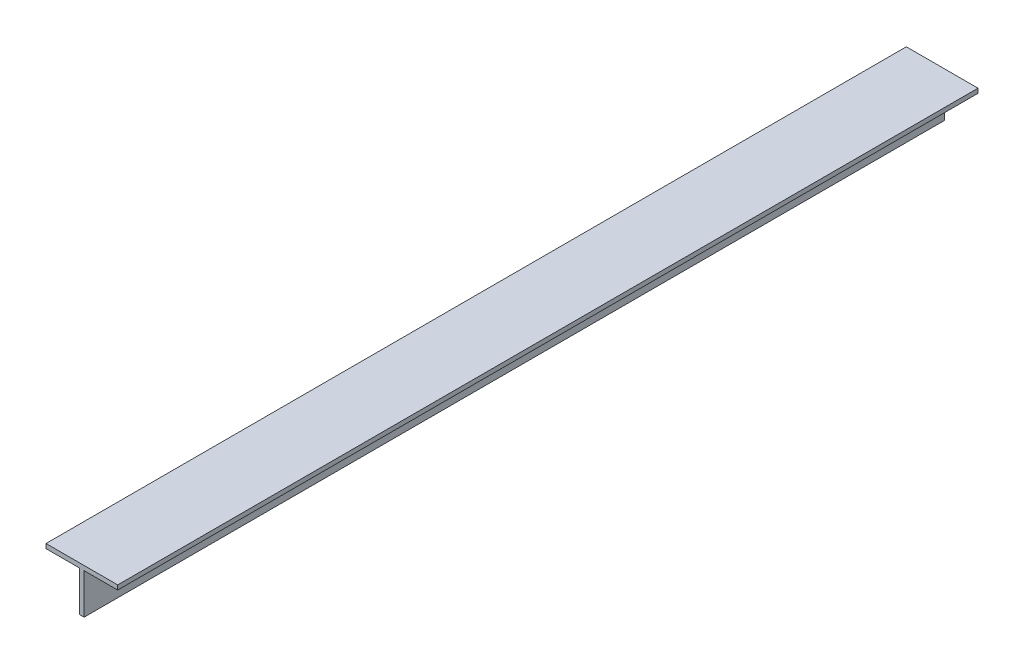
ISO-10303-21;
HEADER;
FILE_DESCRIPTION(('STEP AP214'),'2;1');
FILE_NAME('part.step','',(''),(''),'','','');
FILE_SCHEMA(('AUTOMOTIVE_DESIGN { 1 0 10303 214 1 1 1 1 }'));
ENDSEC;
DATA;
#1=APPLICATION_CONTEXT('core data for automotive mechanical design processes');
#2=APPLICATION_PROTOCOL_DEFINITION('international standard','automotive_design',2000,#1);
#3=PRODUCT_CONTEXT('',#1,'mechanical');
#4=PRODUCT('Part','Part','',(#3));
#5=PRODUCT_RELATED_PRODUCT_CATEGORY('part','',(#4));
#6=PRODUCT_DEFINITION_FORMATION('','',#4);
#7=PRODUCT_DEFINITION_CONTEXT('part definition',#1,'design');
#8=PRODUCT_DEFINITION('design','',#6,#7);
#9=PRODUCT_DEFINITION_SHAPE('','',#8);
#10=(LENGTH_UNIT() NAMED_UNIT(*) SI_UNIT(.MILLI.,.METRE.));
#11=(NAMED_UNIT(*) PLANE_ANGLE_UNIT() SI_UNIT($,.RADIAN.));
#12=(NAMED_UNIT(*) SI_UNIT($,.STERADIAN.) SOLID_ANGLE_UNIT());
#13=UNCERTAINTY_MEASURE_WITH_UNIT(LENGTH_MEASURE(1.E-05),#10,'distance_accuracy_value','');
#14=(GEOMETRIC_REPRESENTATION_CONTEXT(3) GLOBAL_UNCERTAINTY_ASSIGNED_CONTEXT((#13)) GLOBAL_UNIT_ASSIGNED_CONTEXT((#10,
#11,#12)) REPRESENTATION_CONTEXT('',''));
#15=CARTESIAN_POINT('',(0.,0.,0.));
#16=DIRECTION('',(0.,0.,1.));
#17=DIRECTION('',(1.,0.,0.));
#18=AXIS2_PLACEMENT_3D('',#15,#16,#17);
#19=CARTESIAN_POINT('',(25.4,31.75,304.8));
#20=DIRECTION('',(0.,-1.,0.));
#21=DIRECTION('',(0.,0.,-1.));
#22=AXIS2_PLACEMENT_3D('',#19,#20,#21);
#23=PLANE('',#22);
#24=DIRECTION('',(-1.,0.,0.));
#25=VECTOR('',#24,1.);
#26=CARTESIAN_POINT('',(25.4,31.75,-304.8));
#27=LINE('',#26,#25);
#28=CARTESIAN_POINT('',(25.4,31.75,-304.8));
#29=VERTEX_POINT('',#28);
#30=CARTESIAN_POINT('',(-25.4,31.75,-304.8));
#31=VERTEX_POINT('',#30);
#32=EDGE_CURVE('E144',#29,#31,#27,.T.);
#33=ORIENTED_EDGE('',*,*,#32,.T.);
#34=DIRECTION('',(0.,0.,-1.));
#35=VECTOR('',#34,1.);
#36=CARTESIAN_POINT('',(-25.4,31.75,304.8));
#37=LINE('',#36,#35);
#38=CARTESIAN_POINT('',(-25.4,31.75,304.8));
#39=VERTEX_POINT('',#38);
#40=EDGE_CURVE('E11',#39,#31,#37,.T.);
#41=ORIENTED_EDGE('',*,*,#40,.F.);
#42=DIRECTION('',(-1.,0.,0.));
#43=VECTOR('',#42,1.);
#44=CARTESIAN_POINT('',(25.4,31.75,304.8));
#45=LINE('',#44,#43);
#46=CARTESIAN_POINT('',(25.4,31.75,304.8));
#47=VERTEX_POINT('',#46);
#48=EDGE_CURVE('E167',#47,#39,#45,.T.);
#49=ORIENTED_EDGE('',*,*,#48,.F.);
#50=DIRECTION('',(0.,0.,-1.));
#51=VECTOR('',#50,1.);
#52=CARTESIAN_POINT('',(25.4,31.75,304.8));
#53=LINE('',#52,#51);
#54=EDGE_CURVE('E140',#47,#29,#53,.T.);
#55=ORIENTED_EDGE('',*,*,#54,.T.);
#56=EDGE_LOOP('',(#33,#41,#49,#55));
#57=FACE_BOUND('',#56,.T.);
#58=ADVANCED_FACE('F43',(#57),#23,.F.);
#59=CARTESIAN_POINT('',(-25.4,31.75,304.8));
#60=DIRECTION('',(1.,0.,0.));
#61=DIRECTION('',(0.,1.,0.));
#62=AXIS2_PLACEMENT_3D('',#59,#60,#61);
#63=PLANE('',#62);
#64=DIRECTION('',(0.,-1.,0.));
#65=VECTOR('',#64,1.);
#66=CARTESIAN_POINT('',(-25.4,31.75,-304.8));
#67=LINE('',#66,#65);
#68=CARTESIAN_POINT('',(-25.4,28.575,-304.8));
#69=VERTEX_POINT('',#68);
#70=EDGE_CURVE('E148',#31,#69,#67,.T.);
#71=ORIENTED_EDGE('',*,*,#70,.T.);
#72=DIRECTION('',(0.,0.,-1.));
#73=VECTOR('',#72,1.);
#74=CARTESIAN_POINT('',(-25.4,28.575,304.8));
#75=LINE('',#74,#73);
#76=CARTESIAN_POINT('',(-25.4,28.575,304.8));
#77=VERTEX_POINT('',#76);
#78=EDGE_CURVE('E52',#77,#69,#75,.T.);
#79=ORIENTED_EDGE('',*,*,#78,.F.);
#80=DIRECTION('',(0.,-1.,0.));
#81=VECTOR('',#80,1.);
#82=CARTESIAN_POINT('',(-25.4,31.75,304.8));
#83=LINE('',#82,#81);
#84=EDGE_CURVE('E103',#39,#77,#83,.T.);
#85=ORIENTED_EDGE('',*,*,#84,.F.);
#86=ORIENTED_EDGE('',*,*,#40,.T.);
#87=EDGE_LOOP('',(#71,#79,#85,#86));
#88=FACE_BOUND('',#87,.T.);
#89=ADVANCED_FACE('F250',(#88),#63,.F.);
#90=CARTESIAN_POINT('',(-25.4,28.575,304.8));
#91=DIRECTION('',(0.,1.,0.));
#92=DIRECTION('',(0.,0.,1.));
#93=AXIS2_PLACEMENT_3D('',#90,#91,#92);
#94=PLANE('',#93);
#95=DIRECTION('',(1.,0.,0.));
#96=VECTOR('',#95,1.);
#97=CARTESIAN_POINT('',(-25.4,28.575,-304.8));
#98=LINE('',#97,#96);
#99=CARTESIAN_POINT('',(-1.58750000000001,28.575,-304.8));
#100=VERTEX_POINT('',#99);
#101=EDGE_CURVE('E152',#69,#100,#98,.T.);
#102=ORIENTED_EDGE('',*,*,#101,.T.);
#103=DIRECTION('',(0.,0.,-1.));
#104=VECTOR('',#103,1.);
#105=CARTESIAN_POINT('',(-1.58750000000001,28.575,304.8));
#106=LINE('',#105,#104);
#107=CARTESIAN_POINT('',(-1.58750000000001,28.575,304.8));
#108=VERTEX_POINT('',#107);
#109=EDGE_CURVE('E178',#108,#100,#106,.T.);
#110=ORIENTED_EDGE('',*,*,#109,.F.);
#111=DIRECTION('',(1.,0.,0.));
#112=VECTOR('',#111,1.);
#113=CARTESIAN_POINT('',(-25.4,28.575,304.8));
#114=LINE('',#113,#112);
#115=EDGE_CURVE('E188',#77,#108,#114,.T.);
#116=ORIENTED_EDGE('',*,*,#115,.F.);
#117=ORIENTED_EDGE('',*,*,#78,.T.);
#118=EDGE_LOOP('',(#102,#110,#116,#117));
#119=FACE_BOUND('',#118,.T.);
#120=ADVANCED_FACE('F186',(#119),#94,.F.);
#121=CARTESIAN_POINT('',(-1.58750000000001,28.575,304.8));
#122=DIRECTION('',(1.,0.,0.));
#123=DIRECTION('',(0.,1.,0.));
#124=AXIS2_PLACEMENT_3D('',#121,#122,#123);
#125=PLANE('',#124);
#126=CARTESIAN_POINT('',(-1.5875,15.875,200.));
#127=DIRECTION('',(1.,0.,0.));
#128=DIRECTION('',(0.,1.,0.));
#129=AXIS2_PLACEMENT_3D('',#126,#127,#128);
#130=CIRCLE('',#129,3.49999999999996);
#131=CARTESIAN_POINT('',(-1.5875,19.375,200.));
#132=VERTEX_POINT('',#131);
#133=EDGE_CURVE('E149',#132,#132,#130,.T.);
#134=ORIENTED_EDGE('',*,*,#133,.T.);
#135=EDGE_LOOP('',(#134));
#136=FACE_BOUND('',#135,.T.);
#137=CARTESIAN_POINT('',(-1.5875,15.875,-200.));
#138=DIRECTION('',(1.,0.,0.));
#139=DIRECTION('',(0.,1.,0.));
#140=AXIS2_PLACEMENT_3D('',#137,#138,#139);
#141=CIRCLE('',#140,3.49999999999999);
#142=CARTESIAN_POINT('',(-1.5875,19.375,-200.));
#143=VERTEX_POINT('',#142);
#144=EDGE_CURVE('E214',#143,#143,#141,.T.);
#145=ORIENTED_EDGE('',*,*,#144,.T.);
#146=EDGE_LOOP('',(#145));
#147=FACE_BOUND('',#146,.T.);
#148=DIRECTION('',(0.,-1.,0.));
#149=VECTOR('',#148,1.);
#150=CARTESIAN_POINT('',(-1.58750000000001,28.575,-304.8));
#151=LINE('',#150,#149);
#152=CARTESIAN_POINT('',(-1.5875,0.,-304.8));
#153=VERTEX_POINT('',#152);
#154=EDGE_CURVE('E155',#100,#153,#151,.T.);
#155=ORIENTED_EDGE('',*,*,#154,.T.);
#156=DIRECTION('',(0.,0.,-1.));
#157=VECTOR('',#156,1.);
#158=CARTESIAN_POINT('',(-1.5875,0.,304.8));
#159=LINE('',#158,#157);
#160=CARTESIAN_POINT('',(-1.5875,0.,304.8));
#161=VERTEX_POINT('',#160);
#162=EDGE_CURVE('E174',#161,#153,#159,.T.);
#163=ORIENTED_EDGE('',*,*,#162,.F.);
#164=DIRECTION('',(0.,-1.,0.));
#165=VECTOR('',#164,1.);
#166=CARTESIAN_POINT('',(-1.58750000000001,28.575,304.8));
#167=LINE('',#166,#165);
#168=EDGE_CURVE('E201',#108,#161,#167,.T.);
#169=ORIENTED_EDGE('',*,*,#168,.F.);
#170=ORIENTED_EDGE('',*,*,#109,.T.);
#171=EDGE_LOOP('',(#155,#163,#169,#170));
#172=FACE_BOUND('',#171,.T.);
#173=ADVANCED_FACE('F196',(#136,#147,#172),#125,.F.);
#174=CARTESIAN_POINT('',(-1.5875,0.,304.8));
#175=DIRECTION('',(0.,1.,0.));
#176=DIRECTION('',(0.,0.,1.));
#177=AXIS2_PLACEMENT_3D('',#174,#175,#176);
#178=PLANE('',#177);
#179=DIRECTION('',(1.,0.,0.));
#180=VECTOR('',#179,1.);
#181=CARTESIAN_POINT('',(-1.5875,0.,-304.8));
#182=LINE('',#181,#180);
#183=CARTESIAN_POINT('',(1.5875,0.,-304.8));
#184=VERTEX_POINT('',#183);
#185=EDGE_CURVE('E158',#153,#184,#182,.T.);
#186=ORIENTED_EDGE('',*,*,#185,.T.);
#187=DIRECTION('',(0.,0.,-1.));
#188=VECTOR('',#187,1.);
#189=CARTESIAN_POINT('',(1.5875,0.,304.8));
#190=LINE('',#189,#188);
#191=CARTESIAN_POINT('',(1.5875,0.,304.8));
#192=VERTEX_POINT('',#191);
#193=EDGE_CURVE('E133',#192,#184,#190,.T.);
#194=ORIENTED_EDGE('',*,*,#193,.F.);
#195=DIRECTION('',(1.,0.,0.));
#196=VECTOR('',#195,1.);
#197=CARTESIAN_POINT('',(-1.5875,0.,304.8));
#198=LINE('',#197,#196);
#199=EDGE_CURVE('E122',#161,#192,#198,.T.);
#200=ORIENTED_EDGE('',*,*,#199,.F.);
#201=ORIENTED_EDGE('',*,*,#162,.T.);
#202=EDGE_LOOP('',(#186,#194,#200,#201));
#203=FACE_BOUND('',#202,.T.);
#204=ADVANCED_FACE('F199',(#203),#178,.F.);
#205=CARTESIAN_POINT('',(1.5875,0.,304.8));
#206=DIRECTION('',(-1.,0.,0.));
#207=DIRECTION('',(0.,-1.,0.));
#208=AXIS2_PLACEMENT_3D('',#205,#206,#207);
#209=PLANE('',#208);
#210=CARTESIAN_POINT('',(1.5875,15.875,200.));
#211=DIRECTION('',(1.,0.,0.));
#212=DIRECTION('',(0.,1.,0.));
#213=AXIS2_PLACEMENT_3D('',#210,#211,#212);
#214=CIRCLE('',#213,3.49999999999996);
#215=CARTESIAN_POINT('',(1.5875,19.375,200.));
#216=VERTEX_POINT('',#215);
#217=EDGE_CURVE('E218',#216,#216,#214,.T.);
#218=ORIENTED_EDGE('',*,*,#217,.F.);
#219=EDGE_LOOP('',(#218));
#220=FACE_BOUND('',#219,.T.);
#221=CARTESIAN_POINT('',(1.5875,15.875,-200.));
#222=DIRECTION('',(1.,0.,0.));
#223=DIRECTION('',(0.,-1.,0.));
#224=AXIS2_PLACEMENT_3D('',#221,#222,#223);
#225=CIRCLE('',#224,3.49999999999999);
#226=CARTESIAN_POINT('',(1.5875,12.375,-200.));
#227=VERTEX_POINT('',#226);
#228=EDGE_CURVE('E219',#227,#227,#225,.T.);
#229=ORIENTED_EDGE('',*,*,#228,.F.);
#230=EDGE_LOOP('',(#229));
#231=FACE_BOUND('',#230,.T.);
#232=DIRECTION('',(0.,1.,0.));
#233=VECTOR('',#232,1.);
#234=CARTESIAN_POINT('',(1.5875,0.,-304.8));
#235=LINE('',#234,#233);
#236=CARTESIAN_POINT('',(1.58750000000001,28.575,-304.8));
#237=VERTEX_POINT('',#236);
#238=EDGE_CURVE('E131',#184,#237,#235,.T.);
#239=ORIENTED_EDGE('',*,*,#238,.T.);
#240=DIRECTION('',(0.,0.,-1.));
#241=VECTOR('',#240,1.);
#242=CARTESIAN_POINT('',(1.58750000000001,28.575,304.8));
#243=LINE('',#242,#241);
#244=CARTESIAN_POINT('',(1.58750000000001,28.575,304.8));
#245=VERTEX_POINT('',#244);
#246=EDGE_CURVE('E128',#245,#237,#243,.T.);
#247=ORIENTED_EDGE('',*,*,#246,.F.);
#248=DIRECTION('',(0.,1.,0.));
#249=VECTOR('',#248,1.);
#250=CARTESIAN_POINT('',(1.5875,0.,304.8));
#251=LINE('',#250,#249);
#252=EDGE_CURVE('E116',#192,#245,#251,.T.);
#253=ORIENTED_EDGE('',*,*,#252,.F.);
#254=ORIENTED_EDGE('',*,*,#193,.T.);
#255=EDGE_LOOP('',(#239,#247,#253,#254));
#256=FACE_BOUND('',#255,.T.);
#257=ADVANCED_FACE('F129',(#220,#231,#256),#209,.F.);
#258=CARTESIAN_POINT('',(1.58750000000001,28.575,304.8));
#259=DIRECTION('',(0.,1.,0.));
#260=DIRECTION('',(0.,0.,1.));
#261=AXIS2_PLACEMENT_3D('',#258,#259,#260);
#262=PLANE('',#261);
#263=DIRECTION('',(1.,0.,0.));
#264=VECTOR('',#263,1.);
#265=CARTESIAN_POINT('',(1.58750000000001,28.575,-304.8));
#266=LINE('',#265,#264);
#267=CARTESIAN_POINT('',(25.4,28.575,-304.8));
#268=VERTEX_POINT('',#267);
#269=EDGE_CURVE('E89',#237,#268,#266,.T.);
#270=ORIENTED_EDGE('',*,*,#269,.T.);
#271=DIRECTION('',(0.,0.,-1.));
#272=VECTOR('',#271,1.);
#273=CARTESIAN_POINT('',(25.4,28.575,304.8));
#274=LINE('',#273,#272);
#275=CARTESIAN_POINT('',(25.4,28.575,304.8));
#276=VERTEX_POINT('',#275);
#277=EDGE_CURVE('E134',#276,#268,#274,.T.);
#278=ORIENTED_EDGE('',*,*,#277,.F.);
#279=DIRECTION('',(1.,0.,0.));
#280=VECTOR('',#279,1.);
#281=CARTESIAN_POINT('',(1.58750000000001,28.575,304.8));
#282=LINE('',#281,#280);
#283=EDGE_CURVE('E120',#245,#276,#282,.T.);
#284=ORIENTED_EDGE('',*,*,#283,.F.);
#285=ORIENTED_EDGE('',*,*,#246,.T.);
#286=EDGE_LOOP('',(#270,#278,#284,#285));
#287=FACE_BOUND('',#286,.T.);
#288=ADVANCED_FACE('F136',(#287),#262,.F.);
#289=CARTESIAN_POINT('',(25.4,28.575,304.8));
#290=DIRECTION('',(-1.,0.,0.));
#291=DIRECTION('',(0.,-1.,0.));
#292=AXIS2_PLACEMENT_3D('',#289,#290,#291);
#293=PLANE('',#292);
#294=DIRECTION('',(0.,1.,0.));
#295=VECTOR('',#294,1.);
#296=CARTESIAN_POINT('',(25.4,28.575,-304.8));
#297=LINE('',#296,#295);
#298=EDGE_CURVE('E95',#268,#29,#297,.T.);
#299=ORIENTED_EDGE('',*,*,#298,.T.);
#300=ORIENTED_EDGE('',*,*,#54,.F.);
#301=DIRECTION('',(0.,1.,0.));
#302=VECTOR('',#301,1.);
#303=CARTESIAN_POINT('',(25.4,28.575,304.8));
#304=LINE('',#303,#302);
#305=EDGE_CURVE('E60',#276,#47,#304,.T.);
#306=ORIENTED_EDGE('',*,*,#305,.F.);
#307=ORIENTED_EDGE('',*,*,#277,.T.);
#308=EDGE_LOOP('',(#299,#300,#306,#307));
#309=FACE_BOUND('',#308,.T.);
#310=ADVANCED_FACE('F259',(#309),#293,.F.);
#311=CARTESIAN_POINT('',(-25.4,31.75,304.8));
#312=DIRECTION('',(0.,0.,1.));
#313=DIRECTION('',(1.,0.,0.));
#314=AXIS2_PLACEMENT_3D('',#311,#312,#313);
#315=PLANE('',#314);
#316=ORIENTED_EDGE('',*,*,#48,.T.);
#317=ORIENTED_EDGE('',*,*,#84,.T.);
#318=ORIENTED_EDGE('',*,*,#115,.T.);
#319=ORIENTED_EDGE('',*,*,#168,.T.);
#320=ORIENTED_EDGE('',*,*,#199,.T.);
#321=ORIENTED_EDGE('',*,*,#252,.T.);
#322=ORIENTED_EDGE('',*,*,#283,.T.);
#323=ORIENTED_EDGE('',*,*,#305,.T.);
#324=EDGE_LOOP('',(#316,#317,#318,#319,#320,#321,#322,#323));
#325=FACE_BOUND('',#324,.T.);
#326=ADVANCED_FACE('F118',(#325),#315,.T.);
#327=CARTESIAN_POINT('',(-25.4,31.75,-304.8));
#328=DIRECTION('',(0.,0.,1.));
#329=DIRECTION('',(1.,0.,0.));
#330=AXIS2_PLACEMENT_3D('',#327,#328,#329);
#331=PLANE('',#330);
#332=ORIENTED_EDGE('',*,*,#32,.F.);
#333=ORIENTED_EDGE('',*,*,#298,.F.);
#334=ORIENTED_EDGE('',*,*,#269,.F.);
#335=ORIENTED_EDGE('',*,*,#238,.F.);
#336=ORIENTED_EDGE('',*,*,#185,.F.);
#337=ORIENTED_EDGE('',*,*,#154,.F.);
#338=ORIENTED_EDGE('',*,*,#101,.F.);
#339=ORIENTED_EDGE('',*,*,#70,.F.);
#340=EDGE_LOOP('',(#332,#333,#334,#335,#336,#337,#338,#339));
#341=FACE_BOUND('',#340,.T.);
#342=ADVANCED_FACE('F192',(#341),#331,.F.);
#343=CARTESIAN_POINT('',(-25.4,15.875,-200.));
#344=DIRECTION('',(1.,0.,0.));
#345=DIRECTION('',(0.,1.,0.));
#346=AXIS2_PLACEMENT_3D('',#343,#344,#345);
#347=CYLINDRICAL_SURFACE('',#346,3.49999999999999);
#348=ORIENTED_EDGE('',*,*,#228,.T.);
#349=EDGE_LOOP('',(#348));
#350=FACE_BOUND('',#349,.T.);
#351=ORIENTED_EDGE('',*,*,#144,.F.);
#352=EDGE_LOOP('',(#351));
#353=FACE_BOUND('',#352,.T.);
#354=ADVANCED_FACE('F235',(#350,#353),#347,.F.);
#355=CARTESIAN_POINT('',(-25.4,15.875,200.));
#356=DIRECTION('',(1.,0.,0.));
#357=DIRECTION('',(0.,1.,0.));
#358=AXIS2_PLACEMENT_3D('',#355,#356,#357);
#359=CYLINDRICAL_SURFACE('',#358,3.49999999999996);
#360=ORIENTED_EDGE('',*,*,#217,.T.);
#361=EDGE_LOOP('',(#360));
#362=FACE_BOUND('',#361,.T.);
#363=ORIENTED_EDGE('',*,*,#133,.F.);
#364=EDGE_LOOP('',(#363));
#365=FACE_BOUND('',#364,.T.);
#366=ADVANCED_FACE('F227',(#362,#365),#359,.F.);
#367=CLOSED_SHELL('',(#58,#89,#120,#173,#204,#257,#288,#310,#326,#342,#354,#366));
#368=MANIFOLD_SOLID_BREP('B2',#367);
#369=ADVANCED_BREP_SHAPE_REPRESENTATION('',(#18,#368),#14);
#370=SHAPE_DEFINITION_REPRESENTATION(#9,#369);
ENDSEC;
END-ISO-10303-21;
